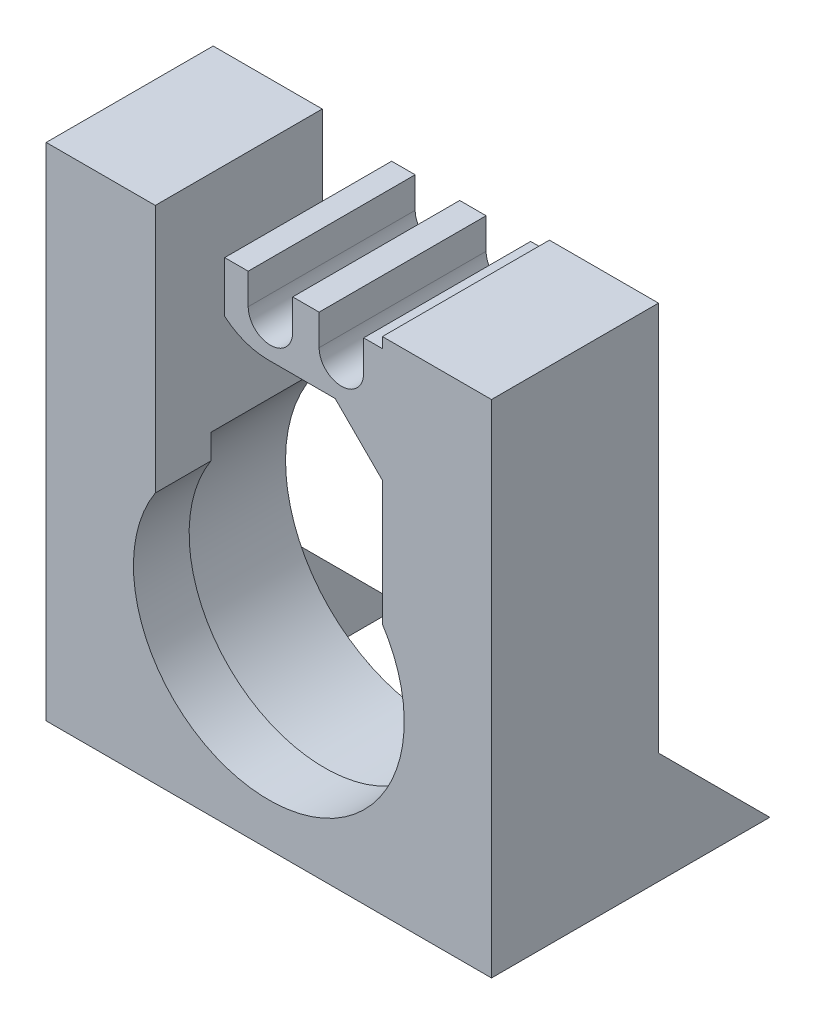
ISO-10303-21;
HEADER;
FILE_DESCRIPTION(('STEP AP214'),'2;1');
FILE_NAME('part.step','',(''),(''),'','','');
FILE_SCHEMA(('AUTOMOTIVE_DESIGN { 1 0 10303 214 1 1 1 1 }'));
ENDSEC;
DATA;
#1=APPLICATION_CONTEXT('core data for automotive mechanical design processes');
#2=APPLICATION_PROTOCOL_DEFINITION('international standard','automotive_design',2000,#1);
#3=PRODUCT_CONTEXT('',#1,'mechanical');
#4=PRODUCT('Part','Part','',(#3));
#5=PRODUCT_RELATED_PRODUCT_CATEGORY('part','',(#4));
#6=PRODUCT_DEFINITION_FORMATION('','',#4);
#7=PRODUCT_DEFINITION_CONTEXT('part definition',#1,'design');
#8=PRODUCT_DEFINITION('design','',#6,#7);
#9=PRODUCT_DEFINITION_SHAPE('','',#8);
#10=(LENGTH_UNIT() NAMED_UNIT(*) SI_UNIT(.MILLI.,.METRE.));
#11=(NAMED_UNIT(*) PLANE_ANGLE_UNIT() SI_UNIT($,.RADIAN.));
#12=(NAMED_UNIT(*) SI_UNIT($,.STERADIAN.) SOLID_ANGLE_UNIT());
#13=UNCERTAINTY_MEASURE_WITH_UNIT(LENGTH_MEASURE(1.E-05),#10,'distance_accuracy_value','');
#14=(GEOMETRIC_REPRESENTATION_CONTEXT(3) GLOBAL_UNCERTAINTY_ASSIGNED_CONTEXT((#13)) GLOBAL_UNIT_ASSIGNED_CONTEXT((#10,
#11,#12)) REPRESENTATION_CONTEXT('',''));
#15=CARTESIAN_POINT('',(0.,0.,0.));
#16=DIRECTION('',(0.,0.,1.));
#17=DIRECTION('',(1.,0.,0.));
#18=AXIS2_PLACEMENT_3D('',#15,#16,#17);
#19=CARTESIAN_POINT('',(20.1030178532085,21.387526043465,0.));
#20=DIRECTION('',(0.,0.,1.));
#21=DIRECTION('',(1.,0.,0.));
#22=AXIS2_PLACEMENT_3D('',#19,#20,#21);
#23=PLANE('',#22);
#24=DIRECTION('',(0.,1.,0.));
#25=VECTOR('',#24,1.);
#26=CARTESIAN_POINT('',(13.1030178532085,21.387526043465,0.));
#27=LINE('',#26,#25);
#28=CARTESIAN_POINT('',(13.1030178532084,11.387526043465,0.));
#29=VERTEX_POINT('',#28);
#30=CARTESIAN_POINT('',(13.1030178532085,21.387526043465,0.));
#31=VERTEX_POINT('',#30);
#32=EDGE_CURVE('E96',#29,#31,#27,.T.);
#33=ORIENTED_EDGE('',*,*,#32,.F.);
#34=DIRECTION('',(-1.,0.,0.));
#35=VECTOR('',#34,1.);
#36=CARTESIAN_POINT('',(20.1030178532084,11.387526043465,0.));
#37=LINE('',#36,#35);
#38=CARTESIAN_POINT('',(20.1030178532084,11.387526043465,0.));
#39=VERTEX_POINT('',#38);
#40=EDGE_CURVE('E12',#39,#29,#37,.T.);
#41=ORIENTED_EDGE('',*,*,#40,.F.);
#42=DIRECTION('',(0.,1.,0.));
#43=VECTOR('',#42,1.);
#44=CARTESIAN_POINT('',(20.1030178532085,21.387526043465,0.));
#45=LINE('',#44,#43);
#46=CARTESIAN_POINT('',(20.1030178532085,21.387526043465,0.));
#47=VERTEX_POINT('',#46);
#48=EDGE_CURVE('E88',#39,#47,#45,.T.);
#49=ORIENTED_EDGE('',*,*,#48,.T.);
#50=DIRECTION('',(-1.,0.,0.));
#51=VECTOR('',#50,1.);
#52=CARTESIAN_POINT('',(20.1030178532085,21.387526043465,0.));
#53=LINE('',#52,#51);
#54=EDGE_CURVE('E47',#47,#31,#53,.T.);
#55=ORIENTED_EDGE('',*,*,#54,.T.);
#56=EDGE_LOOP('',(#33,#41,#49,#55));
#57=FACE_BOUND('',#56,.T.);
#58=ADVANCED_FACE('F44',(#57),#23,.T.);
#59=CARTESIAN_POINT('',(20.1030178532084,11.387526043465,0.));
#60=DIRECTION('',(0.,-1.,0.));
#61=DIRECTION('',(0.,0.,-1.));
#62=AXIS2_PLACEMENT_3D('',#59,#60,#61);
#63=PLANE('',#62);
#64=DIRECTION('',(0.,0.,1.));
#65=VECTOR('',#64,1.);
#66=CARTESIAN_POINT('',(13.1030178532084,11.387526043465,0.));
#67=LINE('',#66,#65);
#68=CARTESIAN_POINT('',(13.1030178532084,11.387526043465,-10.));
#69=VERTEX_POINT('',#68);
#70=EDGE_CURVE('E90',#69,#29,#67,.T.);
#71=ORIENTED_EDGE('',*,*,#70,.F.);
#72=DIRECTION('',(-1.,0.,0.));
#73=VECTOR('',#72,1.);
#74=CARTESIAN_POINT('',(20.1030178532084,11.387526043465,-10.));
#75=LINE('',#74,#73);
#76=CARTESIAN_POINT('',(20.1030178532084,11.387526043465,-10.));
#77=VERTEX_POINT('',#76);
#78=EDGE_CURVE('E53',#77,#69,#75,.T.);
#79=ORIENTED_EDGE('',*,*,#78,.F.);
#80=DIRECTION('',(0.,0.,1.));
#81=VECTOR('',#80,1.);
#82=CARTESIAN_POINT('',(20.1030178532084,11.387526043465,0.));
#83=LINE('',#82,#81);
#84=EDGE_CURVE('E85',#77,#39,#83,.T.);
#85=ORIENTED_EDGE('',*,*,#84,.T.);
#86=ORIENTED_EDGE('',*,*,#40,.T.);
#87=EDGE_LOOP('',(#71,#79,#85,#86));
#88=FACE_BOUND('',#87,.T.);
#89=ADVANCED_FACE('F100',(#88),#63,.T.);
#90=CARTESIAN_POINT('',(20.1030178532084,11.387526043465,-10.));
#91=DIRECTION('',(0.,0.707106781186548,-0.707106781186547));
#92=DIRECTION('',(0.,0.707106781186547,0.707106781186548));
#93=AXIS2_PLACEMENT_3D('',#90,#91,#92);
#94=PLANE('',#93);
#95=DIRECTION('',(0.,-0.707106781186547,-0.707106781186548));
#96=VECTOR('',#95,1.);
#97=CARTESIAN_POINT('',(13.1030178532084,11.387526043465,-10.));
#98=LINE('',#97,#96);
#99=EDGE_CURVE('E83',#31,#69,#98,.T.);
#100=ORIENTED_EDGE('',*,*,#99,.F.);
#101=ORIENTED_EDGE('',*,*,#54,.F.);
#102=DIRECTION('',(0.,-0.707106781186547,-0.707106781186548));
#103=VECTOR('',#102,1.);
#104=CARTESIAN_POINT('',(20.1030178532084,11.387526043465,-10.));
#105=LINE('',#104,#103);
#106=EDGE_CURVE('E81',#47,#77,#105,.T.);
#107=ORIENTED_EDGE('',*,*,#106,.T.);
#108=ORIENTED_EDGE('',*,*,#78,.T.);
#109=EDGE_LOOP('',(#100,#101,#107,#108));
#110=FACE_BOUND('',#109,.T.);
#111=ADVANCED_FACE('F80',(#110),#94,.T.);
#112=CARTESIAN_POINT('',(20.1030178532084,0.,0.));
#113=DIRECTION('',(1.,0.,0.));
#114=DIRECTION('',(0.,1.,0.));
#115=AXIS2_PLACEMENT_3D('',#112,#113,#114);
#116=PLANE('',#115);
#117=ORIENTED_EDGE('',*,*,#48,.F.);
#118=ORIENTED_EDGE('',*,*,#84,.F.);
#119=ORIENTED_EDGE('',*,*,#106,.F.);
#120=EDGE_LOOP('',(#117,#118,#119));
#121=FACE_BOUND('',#120,.T.);
#122=ADVANCED_FACE('F87',(#121),#116,.T.);
#123=CARTESIAN_POINT('',(13.1030178532084,0.,0.));
#124=DIRECTION('',(1.,0.,0.));
#125=DIRECTION('',(0.,1.,0.));
#126=AXIS2_PLACEMENT_3D('',#123,#124,#125);
#127=PLANE('',#126);
#128=ORIENTED_EDGE('',*,*,#32,.T.);
#129=ORIENTED_EDGE('',*,*,#99,.T.);
#130=ORIENTED_EDGE('',*,*,#70,.T.);
#131=EDGE_LOOP('',(#128,#129,#130));
#132=FACE_BOUND('',#131,.T.);
#133=ADVANCED_FACE('F99',(#132),#127,.F.);
#134=CLOSED_SHELL('',(#58,#89,#111,#122,#133));
#135=MANIFOLD_SOLID_BREP('B2',#134);
#136=CARTESIAN_POINT('',(43.3043105971979,36.2386348756426,10.));
#137=DIRECTION('',(1.,0.,0.));
#138=DIRECTION('',(0.,0.,-1.));
#139=AXIS2_PLACEMENT_3D('',#136,#137,#138);
#140=PLANE('',#139);
#141=DIRECTION('',(0.,-1.,0.));
#142=VECTOR('',#141,1.);
#143=CARTESIAN_POINT('',(43.3043105971979,56.387526043465,15.));
#144=LINE('',#143,#142);
#145=CARTESIAN_POINT('',(43.3043105971979,45.2010543814346,15.));
#146=VERTEX_POINT('',#145);
#147=CARTESIAN_POINT('',(43.3043105971979,34.0145827194042,15.));
#148=VERTEX_POINT('',#147);
#149=EDGE_CURVE('E344',#146,#148,#144,.T.);
#150=ORIENTED_EDGE('',*,*,#149,.F.);
#151=DIRECTION('',(0.,0.,1.));
#152=VECTOR('',#151,1.);
#153=CARTESIAN_POINT('',(43.3043105971979,45.2010543814346,-17.4828176530083));
#154=LINE('',#153,#152);
#155=CARTESIAN_POINT('',(43.3043105971979,45.2010543814346,0.));
#156=VERTEX_POINT('',#155);
#157=EDGE_CURVE('E486',#156,#146,#154,.T.);
#158=ORIENTED_EDGE('',*,*,#157,.F.);
#159=DIRECTION('',(0.,-1.,0.));
#160=VECTOR('',#159,1.);
#161=CARTESIAN_POINT('',(43.3043105971979,36.2386348756426,0.));
#162=LINE('',#161,#160);
#163=CARTESIAN_POINT('',(43.3043105971979,36.2386348756426,0.));
#164=VERTEX_POINT('',#163);
#165=EDGE_CURVE('E388',#156,#164,#162,.T.);
#166=ORIENTED_EDGE('',*,*,#165,.T.);
#167=DIRECTION('',(0.,0.,-1.));
#168=VECTOR('',#167,1.);
#169=CARTESIAN_POINT('',(43.3043105971979,36.2386348756426,10.));
#170=LINE('',#169,#168);
#171=CARTESIAN_POINT('',(43.3043105971979,36.2386348756426,10.));
#172=VERTEX_POINT('',#171);
#173=EDGE_CURVE('E398',#172,#164,#170,.T.);
#174=ORIENTED_EDGE('',*,*,#173,.F.);
#175=DIRECTION('',(0.,-1.,0.));
#176=VECTOR('',#175,1.);
#177=CARTESIAN_POINT('',(43.3043105971979,56.387526043465,10.));
#178=LINE('',#177,#176);
#179=CARTESIAN_POINT('',(43.3043105971979,34.0145827194042,10.));
#180=VERTEX_POINT('',#179);
#181=EDGE_CURVE('E357',#172,#180,#178,.T.);
#182=ORIENTED_EDGE('',*,*,#181,.T.);
#183=DIRECTION('',(0.,0.,-1.));
#184=VECTOR('',#183,1.);
#185=CARTESIAN_POINT('',(43.3043105971979,34.0145827194042,15.));
#186=LINE('',#185,#184);
#187=EDGE_CURVE('E368',#148,#180,#186,.T.);
#188=ORIENTED_EDGE('',*,*,#187,.F.);
#189=EDGE_LOOP('',(#150,#158,#166,#174,#182,#188));
#190=FACE_BOUND('',#189,.T.);
#191=ADVANCED_FACE('F141',(#190),#140,.F.);
#192=CARTESIAN_POINT('',(33.1030178532085,27.3964843254976,0.));
#193=DIRECTION('',(0.,0.,1.));
#194=DIRECTION('',(1.,0.,0.));
#195=AXIS2_PLACEMENT_3D('',#192,#193,#194);
#196=PLANE('',#195);
#197=DIRECTION('',(1.,0.,0.));
#198=VECTOR('',#197,1.);
#199=CARTESIAN_POINT('',(46.1030178532085,21.387526043465,0.));
#200=LINE('',#199,#198);
#201=CARTESIAN_POINT('',(46.1030178532085,21.387526043465,0.));
#202=VERTEX_POINT('',#201);
#203=CARTESIAN_POINT('',(53.1030178532085,21.387526043465,0.));
#204=VERTEX_POINT('',#203);
#205=EDGE_CURVE('E360',#202,#204,#200,.T.);
#206=ORIENTED_EDGE('',*,*,#205,.F.);
#207=DIRECTION('',(0.,-1.,0.));
#208=VECTOR('',#207,1.);
#209=CARTESIAN_POINT('',(46.1030178532085,11.387526043465,0.));
#210=LINE('',#209,#208);
#211=CARTESIAN_POINT('',(46.1030178532084,11.387526043465,0.));
#212=VERTEX_POINT('',#211);
#213=EDGE_CURVE('E420',#202,#212,#210,.T.);
#214=ORIENTED_EDGE('',*,*,#213,.T.);
#215=DIRECTION('',(1.,0.,0.));
#216=VECTOR('',#215,1.);
#217=CARTESIAN_POINT('',(13.1030178532084,11.387526043465,0.));
#218=LINE('',#217,#216);
#219=CARTESIAN_POINT('',(13.1030178532084,11.387526043465,0.));
#220=VERTEX_POINT('',#219);
#221=EDGE_CURVE('E381',#220,#212,#218,.T.);
#222=ORIENTED_EDGE('',*,*,#221,.F.);
#223=DIRECTION('',(0.,-1.,0.));
#224=VECTOR('',#223,1.);
#225=CARTESIAN_POINT('',(13.1030178532085,56.387526043465,0.));
#226=LINE('',#225,#224);
#227=CARTESIAN_POINT('',(13.1030178532085,56.387526043465,0.));
#228=VERTEX_POINT('',#227);
#229=EDGE_CURVE('E379',#228,#220,#226,.T.);
#230=ORIENTED_EDGE('',*,*,#229,.F.);
#231=DIRECTION('',(-1.,0.,0.));
#232=VECTOR('',#231,1.);
#233=CARTESIAN_POINT('',(22.901725109219,56.387526043465,0.));
#234=LINE('',#233,#232);
#235=CARTESIAN_POINT('',(22.901725109219,56.387526043465,0.));
#236=VERTEX_POINT('',#235);
#237=EDGE_CURVE('E371',#236,#228,#234,.T.);
#238=ORIENTED_EDGE('',*,*,#237,.F.);
#239=DIRECTION('',(0.,1.,0.));
#240=VECTOR('',#239,1.);
#241=CARTESIAN_POINT('',(22.901725109219,36.2386348756426,0.));
#242=LINE('',#241,#240);
#243=CARTESIAN_POINT('',(22.901725109219,36.2386348756426,0.));
#244=VERTEX_POINT('',#243);
#245=EDGE_CURVE('E376',#244,#236,#242,.T.);
#246=ORIENTED_EDGE('',*,*,#245,.F.);
#247=CARTESIAN_POINT('',(33.1030178532085,27.3964843254976,0.));
#248=DIRECTION('',(0.,0.,-1.));
#249=DIRECTION('',(1.,0.,0.));
#250=AXIS2_PLACEMENT_3D('',#247,#248,#249);
#251=CIRCLE('',#250,13.5);
#252=EDGE_CURVE('E390',#164,#244,#251,.T.);
#253=ORIENTED_EDGE('',*,*,#252,.F.);
#254=ORIENTED_EDGE('',*,*,#165,.F.);
#255=DIRECTION('',(-0.707106781186551,0.707106781186544,0.));
#256=VECTOR('',#255,1.);
#257=CARTESIAN_POINT('',(43.3043105971979,45.2010543814346,0.));
#258=LINE('',#257,#256);
#259=CARTESIAN_POINT('',(39.0616699100786,49.4436950685538,0.));
#260=VERTEX_POINT('',#259);
#261=EDGE_CURVE('E446',#156,#260,#258,.T.);
#262=ORIENTED_EDGE('',*,*,#261,.T.);
#263=DIRECTION('',(-1.,0.,0.));
#264=VECTOR('',#263,1.);
#265=CARTESIAN_POINT('',(39.0616699100786,49.4436950685538,0.));
#266=LINE('',#265,#264);
#267=CARTESIAN_POINT('',(33.0253830112535,49.4436950685538,0.));
#268=VERTEX_POINT('',#267);
#269=EDGE_CURVE('E447',#260,#268,#266,.T.);
#270=ORIENTED_EDGE('',*,*,#269,.T.);
#271=CARTESIAN_POINT('',(33.0253830112535,55.4436950685539,0.));
#272=DIRECTION('',(0.,0.,1.));
#273=DIRECTION('',(1.,0.,0.));
#274=AXIS2_PLACEMENT_3D('',#271,#272,#273);
#275=CIRCLE('',#274,6.00000000000002);
#276=CARTESIAN_POINT('',(29.1361341145693,50.8749159078107,0.));
#277=VERTEX_POINT('',#276);
#278=EDGE_CURVE('E451',#268,#277,#275,.F.);
#279=ORIENTED_EDGE('',*,*,#278,.T.);
#280=DIRECTION('',(0.,1.,0.));
#281=VECTOR('',#280,1.);
#282=CARTESIAN_POINT('',(29.1361341145693,55.4436950685539,0.));
#283=LINE('',#282,#281);
#284=CARTESIAN_POINT('',(29.1361341145693,55.4436950685539,0.));
#285=VERTEX_POINT('',#284);
#286=EDGE_CURVE('E558',#277,#285,#283,.T.);
#287=ORIENTED_EDGE('',*,*,#286,.T.);
#288=DIRECTION('',(1.,0.,0.));
#289=VECTOR('',#288,1.);
#290=CARTESIAN_POINT('',(29.1361341145693,55.4436950685539,0.));
#291=LINE('',#290,#289);
#292=CARTESIAN_POINT('',(31.2468852178852,55.4436950685539,0.));
#293=VERTEX_POINT('',#292);
#294=EDGE_CURVE('E855',#285,#293,#291,.T.);
#295=ORIENTED_EDGE('',*,*,#294,.T.);
#296=DIRECTION('',(0.,-1.,0.));
#297=VECTOR('',#296,1.);
#298=CARTESIAN_POINT('',(31.2468852178852,55.4436950685539,0.));
#299=LINE('',#298,#297);
#300=CARTESIAN_POINT('',(31.2468852178852,52.6792236399918,0.));
#301=VERTEX_POINT('',#300);
#302=EDGE_CURVE('E547',#293,#301,#299,.T.);
#303=ORIENTED_EDGE('',*,*,#302,.T.);
#304=CARTESIAN_POINT('',(33.2468852178852,52.6792236399918,0.));
#305=DIRECTION('',(0.,0.,1.));
#306=DIRECTION('',(1.,0.,0.));
#307=AXIS2_PLACEMENT_3D('',#304,#305,#306);
#308=CIRCLE('',#307,2.);
#309=CARTESIAN_POINT('',(35.2468852178852,52.6792236399918,0.));
#310=VERTEX_POINT('',#309);
#311=EDGE_CURVE('E541',#301,#310,#308,.T.);
#312=ORIENTED_EDGE('',*,*,#311,.T.);
#313=DIRECTION('',(0.,1.,0.));
#314=VECTOR('',#313,1.);
#315=CARTESIAN_POINT('',(35.2468852178852,52.6792236399918,0.));
#316=LINE('',#315,#314);
#317=CARTESIAN_POINT('',(35.2468852178852,55.4436950685539,0.));
#318=VERTEX_POINT('',#317);
#319=EDGE_CURVE('E861',#310,#318,#316,.T.);
#320=ORIENTED_EDGE('',*,*,#319,.T.);
#321=DIRECTION('',(1.,0.,0.));
#322=VECTOR('',#321,1.);
#323=CARTESIAN_POINT('',(35.2468852178852,55.4436950685539,0.));
#324=LINE('',#323,#322);
#325=CARTESIAN_POINT('',(37.6193544062786,55.4436950685539,0.));
#326=VERTEX_POINT('',#325);
#327=EDGE_CURVE('E530',#318,#326,#324,.T.);
#328=ORIENTED_EDGE('',*,*,#327,.T.);
#329=DIRECTION('',(0.,-1.,0.));
#330=VECTOR('',#329,1.);
#331=CARTESIAN_POINT('',(37.6193544062786,55.4436950685539,0.));
#332=LINE('',#331,#330);
#333=CARTESIAN_POINT('',(37.6193544062786,52.6792236399918,0.));
#334=VERTEX_POINT('',#333);
#335=EDGE_CURVE('E524',#326,#334,#332,.T.);
#336=ORIENTED_EDGE('',*,*,#335,.T.);
#337=CARTESIAN_POINT('',(39.6193544062786,52.6792236399918,0.));
#338=DIRECTION('',(0.,0.,1.));
#339=DIRECTION('',(1.,0.,0.));
#340=AXIS2_PLACEMENT_3D('',#337,#338,#339);
#341=CIRCLE('',#340,2.);
#342=CARTESIAN_POINT('',(41.6193544062786,52.6792236399918,0.));
#343=VERTEX_POINT('',#342);
#344=EDGE_CURVE('E865',#334,#343,#341,.T.);
#345=ORIENTED_EDGE('',*,*,#344,.T.);
#346=DIRECTION('',(0.,1.,0.));
#347=VECTOR('',#346,1.);
#348=CARTESIAN_POINT('',(41.6193544062786,52.6792236399918,0.));
#349=LINE('',#348,#347);
#350=CARTESIAN_POINT('',(41.6193544062786,55.4436950685539,0.));
#351=VERTEX_POINT('',#350);
#352=EDGE_CURVE('E445',#343,#351,#349,.T.);
#353=ORIENTED_EDGE('',*,*,#352,.T.);
#354=DIRECTION('',(1.,0.,0.));
#355=VECTOR('',#354,1.);
#356=CARTESIAN_POINT('',(41.6193544062786,55.4436950685539,0.));
#357=LINE('',#356,#355);
#358=CARTESIAN_POINT('',(43.3043105971979,55.4436950685539,0.));
#359=VERTEX_POINT('',#358);
#360=EDGE_CURVE('E428',#351,#359,#357,.T.);
#361=ORIENTED_EDGE('',*,*,#360,.T.);
#362=CARTESIAN_POINT('',(43.3043105971979,56.387526043465,0.));
#363=VERTEX_POINT('',#362);
#364=EDGE_CURVE('E335',#363,#359,#162,.T.);
#365=ORIENTED_EDGE('',*,*,#364,.F.);
#366=DIRECTION('',(-1.,0.,0.));
#367=VECTOR('',#366,1.);
#368=CARTESIAN_POINT('',(43.3043105971979,56.387526043465,0.));
#369=LINE('',#368,#367);
#370=CARTESIAN_POINT('',(53.1030178532084,56.387526043465,0.));
#371=VERTEX_POINT('',#370);
#372=EDGE_CURVE('E386',#371,#363,#369,.T.);
#373=ORIENTED_EDGE('',*,*,#372,.F.);
#374=DIRECTION('',(0.,1.,0.));
#375=VECTOR('',#374,1.);
#376=CARTESIAN_POINT('',(53.1030178532084,56.387526043465,0.));
#377=LINE('',#376,#375);
#378=EDGE_CURVE('E384',#204,#371,#377,.T.);
#379=ORIENTED_EDGE('',*,*,#378,.F.);
#380=EDGE_LOOP('',(#206,#214,#222,#230,#238,#246,#253,#254,#262,#270,#279,#287,#295,#303,#312,
#320,#328,#336,#345,#353,#361,#365,#373,#379));
#381=FACE_BOUND('',#380,.T.);
#382=ADVANCED_FACE('F418',(#381),#196,.F.);
#383=CARTESIAN_POINT('',(22.901725109219,56.387526043465,10.));
#384=DIRECTION('',(0.,-1.,0.));
#385=DIRECTION('',(0.,0.,-1.));
#386=AXIS2_PLACEMENT_3D('',#383,#384,#385);
#387=PLANE('',#386);
#388=ORIENTED_EDGE('',*,*,#237,.T.);
#389=DIRECTION('',(0.,0.,-1.));
#390=VECTOR('',#389,1.);
#391=CARTESIAN_POINT('',(13.1030178532085,56.387526043465,10.));
#392=LINE('',#391,#390);
#393=CARTESIAN_POINT('',(13.1030178532085,56.387526043465,15.));
#394=VERTEX_POINT('',#393);
#395=EDGE_CURVE('E42',#394,#228,#392,.T.);
#396=ORIENTED_EDGE('',*,*,#395,.F.);
#397=DIRECTION('',(-1.,0.,0.));
#398=VECTOR('',#397,1.);
#399=CARTESIAN_POINT('',(13.1030178532085,56.387526043465,15.));
#400=LINE('',#399,#398);
#401=CARTESIAN_POINT('',(22.901725109219,56.387526043465,15.));
#402=VERTEX_POINT('',#401);
#403=EDGE_CURVE('E353',#402,#394,#400,.T.);
#404=ORIENTED_EDGE('',*,*,#403,.F.);
#405=DIRECTION('',(0.,0.,-1.));
#406=VECTOR('',#405,1.);
#407=CARTESIAN_POINT('',(22.901725109219,56.387526043465,10.));
#408=LINE('',#407,#406);
#409=EDGE_CURVE('E375',#402,#236,#408,.T.);
#410=ORIENTED_EDGE('',*,*,#409,.T.);
#411=EDGE_LOOP('',(#388,#396,#404,#410));
#412=FACE_BOUND('',#411,.T.);
#413=ADVANCED_FACE('F143',(#412),#387,.F.);
#414=CARTESIAN_POINT('',(13.1030178532085,56.387526043465,10.));
#415=DIRECTION('',(1.,0.,0.));
#416=DIRECTION('',(0.,1.,0.));
#417=AXIS2_PLACEMENT_3D('',#414,#415,#416);
#418=PLANE('',#417);
#419=ORIENTED_EDGE('',*,*,#229,.T.);
#420=DIRECTION('',(0.,0.,-1.));
#421=VECTOR('',#420,1.);
#422=CARTESIAN_POINT('',(13.1030178532084,11.387526043465,10.));
#423=LINE('',#422,#421);
#424=CARTESIAN_POINT('',(13.1030178532084,11.387526043465,15.));
#425=VERTEX_POINT('',#424);
#426=EDGE_CURVE('E149',#425,#220,#423,.T.);
#427=ORIENTED_EDGE('',*,*,#426,.F.);
#428=DIRECTION('',(0.,-1.,0.));
#429=VECTOR('',#428,1.);
#430=CARTESIAN_POINT('',(13.1030178532085,56.387526043465,15.));
#431=LINE('',#430,#429);
#432=EDGE_CURVE('E365',#394,#425,#431,.T.);
#433=ORIENTED_EDGE('',*,*,#432,.F.);
#434=ORIENTED_EDGE('',*,*,#395,.T.);
#435=EDGE_LOOP('',(#419,#427,#433,#434));
#436=FACE_BOUND('',#435,.T.);
#437=ADVANCED_FACE('F621',(#436),#418,.F.);
#438=CARTESIAN_POINT('',(13.1030178532084,11.387526043465,10.));
#439=DIRECTION('',(0.,1.,0.));
#440=DIRECTION('',(-1.,0.,0.));
#441=AXIS2_PLACEMENT_3D('',#438,#439,#440);
#442=PLANE('',#441);
#443=ORIENTED_EDGE('',*,*,#221,.T.);
#444=DIRECTION('',(0.,0.,-1.));
#445=VECTOR('',#444,1.);
#446=CARTESIAN_POINT('',(46.1030178532085,11.387526043465,-10.));
#447=LINE('',#446,#445);
#448=CARTESIAN_POINT('',(46.1030178532085,11.387526043465,-10.));
#449=VERTEX_POINT('',#448);
#450=EDGE_CURVE('E164',#212,#449,#447,.T.);
#451=ORIENTED_EDGE('',*,*,#450,.T.);
#452=DIRECTION('',(1.,0.,0.));
#453=VECTOR('',#452,1.);
#454=CARTESIAN_POINT('',(46.1030178532085,11.387526043465,-10.));
#455=LINE('',#454,#453);
#456=CARTESIAN_POINT('',(53.1030178532085,11.387526043465,-10.));
#457=VERTEX_POINT('',#456);
#458=EDGE_CURVE('E432',#449,#457,#455,.T.);
#459=ORIENTED_EDGE('',*,*,#458,.T.);
#460=DIRECTION('',(0.,0.,-1.));
#461=VECTOR('',#460,1.);
#462=CARTESIAN_POINT('',(53.1030178532085,11.387526043465,10.));
#463=LINE('',#462,#461);
#464=CARTESIAN_POINT('',(53.1030178532085,11.387526043465,15.));
#465=VERTEX_POINT('',#464);
#466=EDGE_CURVE('E406',#465,#457,#463,.T.);
#467=ORIENTED_EDGE('',*,*,#466,.F.);
#468=DIRECTION('',(1.,0.,0.));
#469=VECTOR('',#468,1.);
#470=CARTESIAN_POINT('',(13.1030178532084,11.387526043465,15.));
#471=LINE('',#470,#469);
#472=EDGE_CURVE('E413',#425,#465,#471,.T.);
#473=ORIENTED_EDGE('',*,*,#472,.F.);
#474=ORIENTED_EDGE('',*,*,#426,.T.);
#475=EDGE_LOOP('',(#443,#451,#459,#467,#473,#474));
#476=FACE_BOUND('',#475,.T.);
#477=ADVANCED_FACE('F411',(#476),#442,.F.);
#478=CARTESIAN_POINT('',(53.1030178532084,56.387526043465,10.));
#479=DIRECTION('',(-1.,0.,0.));
#480=DIRECTION('',(0.,-1.,0.));
#481=AXIS2_PLACEMENT_3D('',#478,#479,#480);
#482=PLANE('',#481);
#483=ORIENTED_EDGE('',*,*,#466,.T.);
#484=DIRECTION('',(0.,0.707106781186548,0.707106781186548));
#485=VECTOR('',#484,1.);
#486=CARTESIAN_POINT('',(53.1030178532085,21.387526043465,0.));
#487=LINE('',#486,#485);
#488=EDGE_CURVE('E423',#457,#204,#487,.T.);
#489=ORIENTED_EDGE('',*,*,#488,.T.);
#490=ORIENTED_EDGE('',*,*,#378,.T.);
#491=DIRECTION('',(0.,0.,-1.));
#492=VECTOR('',#491,1.);
#493=CARTESIAN_POINT('',(53.1030178532084,56.387526043465,10.));
#494=LINE('',#493,#492);
#495=CARTESIAN_POINT('',(53.1030178532084,56.387526043465,15.));
#496=VERTEX_POINT('',#495);
#497=EDGE_CURVE('E403',#496,#371,#494,.T.);
#498=ORIENTED_EDGE('',*,*,#497,.F.);
#499=DIRECTION('',(0.,1.,0.));
#500=VECTOR('',#499,1.);
#501=CARTESIAN_POINT('',(53.1030178532085,11.387526043465,15.));
#502=LINE('',#501,#500);
#503=EDGE_CURVE('E438',#465,#496,#502,.T.);
#504=ORIENTED_EDGE('',*,*,#503,.F.);
#505=EDGE_LOOP('',(#483,#489,#490,#498,#504));
#506=FACE_BOUND('',#505,.T.);
#507=ADVANCED_FACE('F614',(#506),#482,.F.);
#508=CARTESIAN_POINT('',(43.3043105971979,56.387526043465,10.));
#509=DIRECTION('',(0.,-1.,0.));
#510=DIRECTION('',(0.,0.,-1.));
#511=AXIS2_PLACEMENT_3D('',#508,#509,#510);
#512=PLANE('',#511);
#513=ORIENTED_EDGE('',*,*,#372,.T.);
#514=DIRECTION('',(0.,0.,-1.));
#515=VECTOR('',#514,1.);
#516=CARTESIAN_POINT('',(43.3043105971979,56.387526043465,10.));
#517=LINE('',#516,#515);
#518=CARTESIAN_POINT('',(43.3043105971979,56.387526043465,15.));
#519=VERTEX_POINT('',#518);
#520=EDGE_CURVE('E401',#519,#363,#517,.T.);
#521=ORIENTED_EDGE('',*,*,#520,.F.);
#522=DIRECTION('',(-1.,0.,0.));
#523=VECTOR('',#522,1.);
#524=CARTESIAN_POINT('',(53.1030178532084,56.387526043465,15.));
#525=LINE('',#524,#523);
#526=EDGE_CURVE('E342',#496,#519,#525,.T.);
#527=ORIENTED_EDGE('',*,*,#526,.F.);
#528=ORIENTED_EDGE('',*,*,#497,.T.);
#529=EDGE_LOOP('',(#513,#521,#527,#528));
#530=FACE_BOUND('',#529,.T.);
#531=ADVANCED_FACE('F442',(#530),#512,.F.);
#532=ORIENTED_EDGE('',*,*,#364,.T.);
#533=DIRECTION('',(0.,0.,1.));
#534=VECTOR('',#533,1.);
#535=CARTESIAN_POINT('',(43.3043105971979,55.4436950685539,-17.4828176530083));
#536=LINE('',#535,#534);
#537=CARTESIAN_POINT('',(43.3043105971979,55.4436950685539,15.));
#538=VERTEX_POINT('',#537);
#539=EDGE_CURVE('E320',#359,#538,#536,.T.);
#540=ORIENTED_EDGE('',*,*,#539,.T.);
#541=EDGE_CURVE('E333',#519,#538,#144,.T.);
#542=ORIENTED_EDGE('',*,*,#541,.F.);
#543=ORIENTED_EDGE('',*,*,#520,.T.);
#544=EDGE_LOOP('',(#532,#540,#542,#543));
#545=FACE_BOUND('',#544,.T.);
#546=ADVANCED_FACE('F331',(#545),#140,.F.);
#547=CARTESIAN_POINT('',(33.1030178532085,27.3964843254976,10.));
#548=DIRECTION('',(0.,0.,-1.));
#549=DIRECTION('',(-1.,0.,0.));
#550=AXIS2_PLACEMENT_3D('',#547,#548,#549);
#551=CYLINDRICAL_SURFACE('',#550,13.5);
#552=ORIENTED_EDGE('',*,*,#252,.T.);
#553=DIRECTION('',(0.,0.,-1.));
#554=VECTOR('',#553,1.);
#555=CARTESIAN_POINT('',(22.901725109219,36.2386348756426,10.));
#556=LINE('',#555,#554);
#557=CARTESIAN_POINT('',(22.901725109219,36.2386348756426,10.));
#558=VERTEX_POINT('',#557);
#559=EDGE_CURVE('E395',#558,#244,#556,.T.);
#560=ORIENTED_EDGE('',*,*,#559,.F.);
#561=CARTESIAN_POINT('',(33.1030178532085,27.3964843254976,10.));
#562=DIRECTION('',(0.,0.,-1.));
#563=DIRECTION('',(1.,0.,0.));
#564=AXIS2_PLACEMENT_3D('',#561,#562,#563);
#565=CIRCLE('',#564,13.5);
#566=EDGE_CURVE('E372',#172,#558,#565,.T.);
#567=ORIENTED_EDGE('',*,*,#566,.F.);
#568=ORIENTED_EDGE('',*,*,#173,.T.);
#569=EDGE_LOOP('',(#552,#560,#567,#568));
#570=FACE_BOUND('',#569,.T.);
#571=ADVANCED_FACE('F587',(#570),#551,.F.);
#572=CARTESIAN_POINT('',(22.901725109219,36.2386348756426,10.));
#573=DIRECTION('',(-1.,0.,0.));
#574=DIRECTION('',(0.,0.,1.));
#575=AXIS2_PLACEMENT_3D('',#572,#573,#574);
#576=PLANE('',#575);
#577=ORIENTED_EDGE('',*,*,#245,.T.);
#578=ORIENTED_EDGE('',*,*,#409,.F.);
#579=DIRECTION('',(0.,1.,0.));
#580=VECTOR('',#579,1.);
#581=CARTESIAN_POINT('',(22.901725109219,56.387526043465,15.));
#582=LINE('',#581,#580);
#583=CARTESIAN_POINT('',(22.901725109219,34.0145827194042,15.));
#584=VERTEX_POINT('',#583);
#585=EDGE_CURVE('E346',#584,#402,#582,.T.);
#586=ORIENTED_EDGE('',*,*,#585,.F.);
#587=DIRECTION('',(0.,0.,-1.));
#588=VECTOR('',#587,1.);
#589=CARTESIAN_POINT('',(22.901725109219,34.0145827194042,15.));
#590=LINE('',#589,#588);
#591=CARTESIAN_POINT('',(22.901725109219,34.0145827194042,10.));
#592=VERTEX_POINT('',#591);
#593=EDGE_CURVE('E356',#584,#592,#590,.T.);
#594=ORIENTED_EDGE('',*,*,#593,.T.);
#595=DIRECTION('',(0.,1.,0.));
#596=VECTOR('',#595,1.);
#597=CARTESIAN_POINT('',(22.901725109219,56.387526043465,10.));
#598=LINE('',#597,#596);
#599=EDGE_CURVE('E362',#592,#558,#598,.T.);
#600=ORIENTED_EDGE('',*,*,#599,.T.);
#601=ORIENTED_EDGE('',*,*,#559,.T.);
#602=EDGE_LOOP('',(#577,#578,#586,#594,#600,#601));
#603=FACE_BOUND('',#602,.T.);
#604=ADVANCED_FACE('F582',(#603),#576,.F.);
#605=CARTESIAN_POINT('',(33.1030178532085,27.3964843254976,10.));
#606=DIRECTION('',(0.,0.,1.));
#607=DIRECTION('',(1.,0.,0.));
#608=AXIS2_PLACEMENT_3D('',#605,#606,#607);
#609=PLANE('',#608);
#610=ORIENTED_EDGE('',*,*,#181,.F.);
#611=ORIENTED_EDGE('',*,*,#566,.T.);
#612=ORIENTED_EDGE('',*,*,#599,.F.);
#613=CARTESIAN_POINT('',(33.1030178532085,27.3964843254976,10.));
#614=DIRECTION('',(0.,0.,-1.));
#615=DIRECTION('',(1.,0.,0.));
#616=AXIS2_PLACEMENT_3D('',#613,#614,#615);
#617=CIRCLE('',#616,12.16);
#618=EDGE_CURVE('E359',#180,#592,#617,.T.);
#619=ORIENTED_EDGE('',*,*,#618,.F.);
#620=EDGE_LOOP('',(#610,#611,#612,#619));
#621=FACE_BOUND('',#620,.T.);
#622=ADVANCED_FACE('F591',(#621),#609,.F.);
#623=CARTESIAN_POINT('',(33.1030178532085,27.3964843254976,15.));
#624=DIRECTION('',(0.,0.,-1.));
#625=DIRECTION('',(-1.,0.,0.));
#626=AXIS2_PLACEMENT_3D('',#623,#624,#625);
#627=CYLINDRICAL_SURFACE('',#626,12.16);
#628=ORIENTED_EDGE('',*,*,#618,.T.);
#629=ORIENTED_EDGE('',*,*,#593,.F.);
#630=CARTESIAN_POINT('',(33.1030178532085,27.3964843254976,15.));
#631=DIRECTION('',(0.,0.,-1.));
#632=DIRECTION('',(1.,0.,0.));
#633=AXIS2_PLACEMENT_3D('',#630,#631,#632);
#634=CIRCLE('',#633,12.16);
#635=EDGE_CURVE('E343',#148,#584,#634,.T.);
#636=ORIENTED_EDGE('',*,*,#635,.F.);
#637=ORIENTED_EDGE('',*,*,#187,.T.);
#638=EDGE_LOOP('',(#628,#629,#636,#637));
#639=FACE_BOUND('',#638,.T.);
#640=ADVANCED_FACE('F578',(#639),#627,.F.);
#641=CARTESIAN_POINT('',(33.1030178532085,27.3964843254976,15.));
#642=DIRECTION('',(0.,0.,1.));
#643=DIRECTION('',(1.,0.,0.));
#644=AXIS2_PLACEMENT_3D('',#641,#642,#643);
#645=PLANE('',#644);
#646=ORIENTED_EDGE('',*,*,#432,.T.);
#647=ORIENTED_EDGE('',*,*,#472,.T.);
#648=ORIENTED_EDGE('',*,*,#503,.T.);
#649=ORIENTED_EDGE('',*,*,#526,.T.);
#650=ORIENTED_EDGE('',*,*,#541,.T.);
#651=DIRECTION('',(-1.,0.,0.));
#652=VECTOR('',#651,1.);
#653=CARTESIAN_POINT('',(41.6193544062786,55.4436950685539,15.));
#654=LINE('',#653,#652);
#655=CARTESIAN_POINT('',(41.6193544062786,55.4436950685539,15.));
#656=VERTEX_POINT('',#655);
#657=EDGE_CURVE('E316',#538,#656,#654,.T.);
#658=ORIENTED_EDGE('',*,*,#657,.T.);
#659=DIRECTION('',(0.,-1.,0.));
#660=VECTOR('',#659,1.);
#661=CARTESIAN_POINT('',(41.6193544062786,52.6792236399918,15.));
#662=LINE('',#661,#660);
#663=CARTESIAN_POINT('',(41.6193544062786,52.6792236399918,15.));
#664=VERTEX_POINT('',#663);
#665=EDGE_CURVE('E327',#656,#664,#662,.T.);
#666=ORIENTED_EDGE('',*,*,#665,.T.);
#667=CARTESIAN_POINT('',(39.6193544062786,52.6792236399918,15.));
#668=DIRECTION('',(0.,0.,-1.));
#669=DIRECTION('',(1.,0.,0.));
#670=AXIS2_PLACEMENT_3D('',#667,#668,#669);
#671=CIRCLE('',#670,2.);
#672=CARTESIAN_POINT('',(37.6193544062786,52.6792236399918,15.));
#673=VERTEX_POINT('',#672);
#674=EDGE_CURVE('E456',#664,#673,#671,.T.);
#675=ORIENTED_EDGE('',*,*,#674,.T.);
#676=DIRECTION('',(0.,1.,0.));
#677=VECTOR('',#676,1.);
#678=CARTESIAN_POINT('',(37.6193544062786,55.4436950685539,15.));
#679=LINE('',#678,#677);
#680=CARTESIAN_POINT('',(37.6193544062786,55.4436950685539,15.));
#681=VERTEX_POINT('',#680);
#682=EDGE_CURVE('E459',#673,#681,#679,.T.);
#683=ORIENTED_EDGE('',*,*,#682,.T.);
#684=DIRECTION('',(-1.,0.,0.));
#685=VECTOR('',#684,1.);
#686=CARTESIAN_POINT('',(35.2468852178852,55.4436950685539,15.));
#687=LINE('',#686,#685);
#688=CARTESIAN_POINT('',(35.2468852178852,55.4436950685539,15.));
#689=VERTEX_POINT('',#688);
#690=EDGE_CURVE('E462',#681,#689,#687,.T.);
#691=ORIENTED_EDGE('',*,*,#690,.T.);
#692=DIRECTION('',(0.,-1.,0.));
#693=VECTOR('',#692,1.);
#694=CARTESIAN_POINT('',(35.2468852178852,52.6792236399918,15.));
#695=LINE('',#694,#693);
#696=CARTESIAN_POINT('',(35.2468852178852,52.6792236399918,15.));
#697=VERTEX_POINT('',#696);
#698=EDGE_CURVE('E465',#689,#697,#695,.T.);
#699=ORIENTED_EDGE('',*,*,#698,.T.);
#700=CARTESIAN_POINT('',(33.2468852178852,52.6792236399918,15.));
#701=DIRECTION('',(0.,0.,-1.));
#702=DIRECTION('',(1.,0.,0.));
#703=AXIS2_PLACEMENT_3D('',#700,#701,#702);
#704=CIRCLE('',#703,2.);
#705=CARTESIAN_POINT('',(31.2468852178852,52.6792236399918,15.));
#706=VERTEX_POINT('',#705);
#707=EDGE_CURVE('E468',#697,#706,#704,.T.);
#708=ORIENTED_EDGE('',*,*,#707,.T.);
#709=DIRECTION('',(0.,1.,0.));
#710=VECTOR('',#709,1.);
#711=CARTESIAN_POINT('',(31.2468852178852,55.4436950685539,15.));
#712=LINE('',#711,#710);
#713=CARTESIAN_POINT('',(31.2468852178852,55.4436950685539,15.));
#714=VERTEX_POINT('',#713);
#715=EDGE_CURVE('E471',#706,#714,#712,.T.);
#716=ORIENTED_EDGE('',*,*,#715,.T.);
#717=DIRECTION('',(-1.,0.,0.));
#718=VECTOR('',#717,1.);
#719=CARTESIAN_POINT('',(29.1361341145693,55.4436950685539,15.));
#720=LINE('',#719,#718);
#721=CARTESIAN_POINT('',(29.1361341145693,55.4436950685539,15.));
#722=VERTEX_POINT('',#721);
#723=EDGE_CURVE('E474',#714,#722,#720,.T.);
#724=ORIENTED_EDGE('',*,*,#723,.T.);
#725=DIRECTION('',(0.,-1.,0.));
#726=VECTOR('',#725,1.);
#727=CARTESIAN_POINT('',(29.1361341145693,55.4436950685539,15.));
#728=LINE('',#727,#726);
#729=CARTESIAN_POINT('',(29.1361341145693,50.8749159078107,15.));
#730=VERTEX_POINT('',#729);
#731=EDGE_CURVE('E477',#722,#730,#728,.T.);
#732=ORIENTED_EDGE('',*,*,#731,.T.);
#733=CARTESIAN_POINT('',(33.0253830112535,55.4436950685539,15.));
#734=DIRECTION('',(0.,0.,1.));
#735=DIRECTION('',(-1.,0.,0.));
#736=AXIS2_PLACEMENT_3D('',#733,#734,#735);
#737=CIRCLE('',#736,6.00000000000002);
#738=CARTESIAN_POINT('',(33.0253830112535,49.4436950685538,15.));
#739=VERTEX_POINT('',#738);
#740=EDGE_CURVE('E480',#730,#739,#737,.T.);
#741=ORIENTED_EDGE('',*,*,#740,.T.);
#742=DIRECTION('',(1.,0.,0.));
#743=VECTOR('',#742,1.);
#744=CARTESIAN_POINT('',(39.0616699100786,49.4436950685538,15.));
#745=LINE('',#744,#743);
#746=CARTESIAN_POINT('',(39.0616699100786,49.4436950685538,15.));
#747=VERTEX_POINT('',#746);
#748=EDGE_CURVE('E483',#739,#747,#745,.T.);
#749=ORIENTED_EDGE('',*,*,#748,.T.);
#750=DIRECTION('',(0.707106781186551,-0.707106781186544,0.));
#751=VECTOR('',#750,1.);
#752=CARTESIAN_POINT('',(43.3043105971979,45.2010543814346,15.));
#753=LINE('',#752,#751);
#754=EDGE_CURVE('E156',#747,#146,#753,.T.);
#755=ORIENTED_EDGE('',*,*,#754,.T.);
#756=ORIENTED_EDGE('',*,*,#149,.T.);
#757=ORIENTED_EDGE('',*,*,#635,.T.);
#758=ORIENTED_EDGE('',*,*,#585,.T.);
#759=ORIENTED_EDGE('',*,*,#403,.T.);
#760=EDGE_LOOP('',(#646,#647,#648,#649,#650,#658,#666,#675,#683,#691,#699,#708,#716,#724,#732,
#741,#749,#755,#756,#757,#758,#759));
#761=FACE_BOUND('',#760,.T.);
#762=ADVANCED_FACE('F339',(#761),#645,.T.);
#763=CARTESIAN_POINT('',(46.1030178532085,21.387526043465,0.));
#764=DIRECTION('',(0.,0.707106781186547,-0.707106781186547));
#765=DIRECTION('',(0.,0.707106781186548,0.707106781186548));
#766=AXIS2_PLACEMENT_3D('',#763,#764,#765);
#767=PLANE('',#766);
#768=ORIENTED_EDGE('',*,*,#488,.F.);
#769=ORIENTED_EDGE('',*,*,#458,.F.);
#770=DIRECTION('',(0.,0.707106781186548,0.707106781186548));
#771=VECTOR('',#770,1.);
#772=CARTESIAN_POINT('',(46.1030178532085,21.387526043465,0.));
#773=LINE('',#772,#771);
#774=EDGE_CURVE('E425',#449,#202,#773,.T.);
#775=ORIENTED_EDGE('',*,*,#774,.T.);
#776=ORIENTED_EDGE('',*,*,#205,.T.);
#777=EDGE_LOOP('',(#768,#769,#775,#776));
#778=FACE_BOUND('',#777,.T.);
#779=ADVANCED_FACE('F652',(#778),#767,.T.);
#780=CARTESIAN_POINT('',(46.1030178532085,0.,0.));
#781=DIRECTION('',(1.,0.,0.));
#782=DIRECTION('',(0.,0.,-1.));
#783=AXIS2_PLACEMENT_3D('',#780,#781,#782);
#784=PLANE('',#783);
#785=ORIENTED_EDGE('',*,*,#213,.F.);
#786=ORIENTED_EDGE('',*,*,#774,.F.);
#787=ORIENTED_EDGE('',*,*,#450,.F.);
#788=EDGE_LOOP('',(#785,#786,#787));
#789=FACE_BOUND('',#788,.T.);
#790=ADVANCED_FACE('F662',(#789),#784,.F.);
#791=CARTESIAN_POINT('',(43.3043105971979,45.2010543814346,-17.4828176530083));
#792=DIRECTION('',(-0.707106781186544,-0.707106781186551,0.));
#793=DIRECTION('',(0.707106781186551,-0.707106781186544,0.));
#794=AXIS2_PLACEMENT_3D('',#791,#792,#793);
#795=PLANE('',#794);
#796=ORIENTED_EDGE('',*,*,#261,.F.);
#797=ORIENTED_EDGE('',*,*,#157,.T.);
#798=ORIENTED_EDGE('',*,*,#754,.F.);
#799=DIRECTION('',(0.,0.,1.));
#800=VECTOR('',#799,1.);
#801=CARTESIAN_POINT('',(39.0616699100786,49.4436950685538,-17.4828176530083));
#802=LINE('',#801,#800);
#803=EDGE_CURVE('E488',#260,#747,#802,.T.);
#804=ORIENTED_EDGE('',*,*,#803,.F.);
#805=EDGE_LOOP('',(#796,#797,#798,#804));
#806=FACE_BOUND('',#805,.T.);
#807=ADVANCED_FACE('F568',(#806),#795,.T.);
#808=CARTESIAN_POINT('',(39.0616699100786,49.4436950685538,-17.4828176530083));
#809=DIRECTION('',(0.,-1.,0.));
#810=DIRECTION('',(0.,0.,-1.));
#811=AXIS2_PLACEMENT_3D('',#808,#809,#810);
#812=PLANE('',#811);
#813=ORIENTED_EDGE('',*,*,#269,.F.);
#814=ORIENTED_EDGE('',*,*,#803,.T.);
#815=ORIENTED_EDGE('',*,*,#748,.F.);
#816=DIRECTION('',(0.,0.,1.));
#817=VECTOR('',#816,1.);
#818=CARTESIAN_POINT('',(33.0253830112535,49.4436950685538,-17.4828176530083));
#819=LINE('',#818,#817);
#820=EDGE_CURVE('E490',#268,#739,#819,.T.);
#821=ORIENTED_EDGE('',*,*,#820,.F.);
#822=EDGE_LOOP('',(#813,#814,#815,#821));
#823=FACE_BOUND('',#822,.T.);
#824=ADVANCED_FACE('F565',(#823),#812,.T.);
#825=CARTESIAN_POINT('',(33.0253830112535,55.4436950685539,-17.4828176530083));
#826=DIRECTION('',(0.,0.,1.));
#827=DIRECTION('',(1.,0.,0.));
#828=AXIS2_PLACEMENT_3D('',#825,#826,#827);
#829=CYLINDRICAL_SURFACE('',#828,6.00000000000002);
#830=ORIENTED_EDGE('',*,*,#278,.F.);
#831=ORIENTED_EDGE('',*,*,#820,.T.);
#832=ORIENTED_EDGE('',*,*,#740,.F.);
#833=DIRECTION('',(0.,0.,1.));
#834=VECTOR('',#833,1.);
#835=CARTESIAN_POINT('',(29.1361341145693,50.8749159078107,-17.4828176530083));
#836=LINE('',#835,#834);
#837=EDGE_CURVE('E492',#277,#730,#836,.T.);
#838=ORIENTED_EDGE('',*,*,#837,.F.);
#839=EDGE_LOOP('',(#830,#831,#832,#838));
#840=FACE_BOUND('',#839,.T.);
#841=ADVANCED_FACE('F561',(#840),#829,.T.);
#842=CARTESIAN_POINT('',(29.1361341145693,55.4436950685539,-17.4828176530083));
#843=DIRECTION('',(-1.,0.,0.));
#844=DIRECTION('',(0.,0.,1.));
#845=AXIS2_PLACEMENT_3D('',#842,#843,#844);
#846=PLANE('',#845);
#847=ORIENTED_EDGE('',*,*,#286,.F.);
#848=ORIENTED_EDGE('',*,*,#837,.T.);
#849=ORIENTED_EDGE('',*,*,#731,.F.);
#850=DIRECTION('',(0.,0.,1.));
#851=VECTOR('',#850,1.);
#852=CARTESIAN_POINT('',(29.1361341145693,55.4436950685539,-17.4828176530083));
#853=LINE('',#852,#851);
#854=EDGE_CURVE('E494',#285,#722,#853,.T.);
#855=ORIENTED_EDGE('',*,*,#854,.F.);
#856=EDGE_LOOP('',(#847,#848,#849,#855));
#857=FACE_BOUND('',#856,.T.);
#858=ADVANCED_FACE('F556',(#857),#846,.T.);
#859=CARTESIAN_POINT('',(29.1361341145693,55.4436950685539,-17.4828176530083));
#860=DIRECTION('',(0.,1.,0.));
#861=DIRECTION('',(0.,0.,1.));
#862=AXIS2_PLACEMENT_3D('',#859,#860,#861);
#863=PLANE('',#862);
#864=ORIENTED_EDGE('',*,*,#294,.F.);
#865=ORIENTED_EDGE('',*,*,#854,.T.);
#866=ORIENTED_EDGE('',*,*,#723,.F.);
#867=DIRECTION('',(0.,0.,1.));
#868=VECTOR('',#867,1.);
#869=CARTESIAN_POINT('',(31.2468852178852,55.4436950685539,-17.4828176530083));
#870=LINE('',#869,#868);
#871=EDGE_CURVE('E496',#293,#714,#870,.T.);
#872=ORIENTED_EDGE('',*,*,#871,.F.);
#873=EDGE_LOOP('',(#864,#865,#866,#872));
#874=FACE_BOUND('',#873,.T.);
#875=ADVANCED_FACE('F550',(#874),#863,.T.);
#876=CARTESIAN_POINT('',(31.2468852178852,55.4436950685539,-17.4828176530083));
#877=DIRECTION('',(1.,0.,0.));
#878=DIRECTION('',(0.,0.,-1.));
#879=AXIS2_PLACEMENT_3D('',#876,#877,#878);
#880=PLANE('',#879);
#881=ORIENTED_EDGE('',*,*,#302,.F.);
#882=ORIENTED_EDGE('',*,*,#871,.T.);
#883=ORIENTED_EDGE('',*,*,#715,.F.);
#884=DIRECTION('',(0.,0.,1.));
#885=VECTOR('',#884,1.);
#886=CARTESIAN_POINT('',(31.2468852178852,52.6792236399918,-17.4828176530083));
#887=LINE('',#886,#885);
#888=EDGE_CURVE('E498',#301,#706,#887,.T.);
#889=ORIENTED_EDGE('',*,*,#888,.F.);
#890=EDGE_LOOP('',(#881,#882,#883,#889));
#891=FACE_BOUND('',#890,.T.);
#892=ADVANCED_FACE('F544',(#891),#880,.T.);
#893=CARTESIAN_POINT('',(33.2468852178852,52.6792236399918,-17.4828176530083));
#894=DIRECTION('',(0.,0.,1.));
#895=DIRECTION('',(1.,0.,0.));
#896=AXIS2_PLACEMENT_3D('',#893,#894,#895);
#897=CYLINDRICAL_SURFACE('',#896,2.);
#898=ORIENTED_EDGE('',*,*,#311,.F.);
#899=ORIENTED_EDGE('',*,*,#888,.T.);
#900=ORIENTED_EDGE('',*,*,#707,.F.);
#901=DIRECTION('',(0.,0.,1.));
#902=VECTOR('',#901,1.);
#903=CARTESIAN_POINT('',(35.2468852178852,52.6792236399918,-17.4828176530083));
#904=LINE('',#903,#902);
#905=EDGE_CURVE('E500',#310,#697,#904,.T.);
#906=ORIENTED_EDGE('',*,*,#905,.F.);
#907=EDGE_LOOP('',(#898,#899,#900,#906));
#908=FACE_BOUND('',#907,.T.);
#909=ADVANCED_FACE('F539',(#908),#897,.F.);
#910=CARTESIAN_POINT('',(35.2468852178852,52.6792236399918,-17.4828176530083));
#911=DIRECTION('',(-1.,0.,0.));
#912=DIRECTION('',(0.,0.,1.));
#913=AXIS2_PLACEMENT_3D('',#910,#911,#912);
#914=PLANE('',#913);
#915=ORIENTED_EDGE('',*,*,#319,.F.);
#916=ORIENTED_EDGE('',*,*,#905,.T.);
#917=ORIENTED_EDGE('',*,*,#698,.F.);
#918=DIRECTION('',(0.,0.,1.));
#919=VECTOR('',#918,1.);
#920=CARTESIAN_POINT('',(35.2468852178852,55.4436950685539,-17.4828176530083));
#921=LINE('',#920,#919);
#922=EDGE_CURVE('E502',#318,#689,#921,.T.);
#923=ORIENTED_EDGE('',*,*,#922,.F.);
#924=EDGE_LOOP('',(#915,#916,#917,#923));
#925=FACE_BOUND('',#924,.T.);
#926=ADVANCED_FACE('F533',(#925),#914,.T.);
#927=CARTESIAN_POINT('',(35.2468852178852,55.4436950685539,-17.4828176530083));
#928=DIRECTION('',(0.,1.,0.));
#929=DIRECTION('',(0.,0.,1.));
#930=AXIS2_PLACEMENT_3D('',#927,#928,#929);
#931=PLANE('',#930);
#932=ORIENTED_EDGE('',*,*,#327,.F.);
#933=ORIENTED_EDGE('',*,*,#922,.T.);
#934=ORIENTED_EDGE('',*,*,#690,.F.);
#935=DIRECTION('',(0.,0.,1.));
#936=VECTOR('',#935,1.);
#937=CARTESIAN_POINT('',(37.6193544062786,55.4436950685539,-17.4828176530083));
#938=LINE('',#937,#936);
#939=EDGE_CURVE('E504',#326,#681,#938,.T.);
#940=ORIENTED_EDGE('',*,*,#939,.F.);
#941=EDGE_LOOP('',(#932,#933,#934,#940));
#942=FACE_BOUND('',#941,.T.);
#943=ADVANCED_FACE('F527',(#942),#931,.T.);
#944=CARTESIAN_POINT('',(37.6193544062786,55.4436950685539,-17.4828176530083));
#945=DIRECTION('',(1.,0.,0.));
#946=DIRECTION('',(0.,1.,0.));
#947=AXIS2_PLACEMENT_3D('',#944,#945,#946);
#948=PLANE('',#947);
#949=ORIENTED_EDGE('',*,*,#335,.F.);
#950=ORIENTED_EDGE('',*,*,#939,.T.);
#951=ORIENTED_EDGE('',*,*,#682,.F.);
#952=DIRECTION('',(0.,0.,1.));
#953=VECTOR('',#952,1.);
#954=CARTESIAN_POINT('',(37.6193544062786,52.6792236399918,-17.4828176530083));
#955=LINE('',#954,#953);
#956=EDGE_CURVE('E506',#334,#673,#955,.T.);
#957=ORIENTED_EDGE('',*,*,#956,.F.);
#958=EDGE_LOOP('',(#949,#950,#951,#957));
#959=FACE_BOUND('',#958,.T.);
#960=ADVANCED_FACE('F522',(#959),#948,.T.);
#961=CARTESIAN_POINT('',(39.6193544062786,52.6792236399918,-17.4828176530083));
#962=DIRECTION('',(0.,0.,1.));
#963=DIRECTION('',(1.,0.,0.));
#964=AXIS2_PLACEMENT_3D('',#961,#962,#963);
#965=CYLINDRICAL_SURFACE('',#964,2.);
#966=ORIENTED_EDGE('',*,*,#344,.F.);
#967=ORIENTED_EDGE('',*,*,#956,.T.);
#968=ORIENTED_EDGE('',*,*,#674,.F.);
#969=DIRECTION('',(0.,0.,1.));
#970=VECTOR('',#969,1.);
#971=CARTESIAN_POINT('',(41.6193544062786,52.6792236399918,-17.4828176530083));
#972=LINE('',#971,#970);
#973=EDGE_CURVE('E508',#343,#664,#972,.T.);
#974=ORIENTED_EDGE('',*,*,#973,.F.);
#975=EDGE_LOOP('',(#966,#967,#968,#974));
#976=FACE_BOUND('',#975,.T.);
#977=ADVANCED_FACE('F516',(#976),#965,.F.);
#978=CARTESIAN_POINT('',(41.6193544062786,52.6792236399918,-17.4828176530083));
#979=DIRECTION('',(-1.,0.,0.));
#980=DIRECTION('',(0.,-1.,0.));
#981=AXIS2_PLACEMENT_3D('',#978,#979,#980);
#982=PLANE('',#981);
#983=ORIENTED_EDGE('',*,*,#352,.F.);
#984=ORIENTED_EDGE('',*,*,#973,.T.);
#985=ORIENTED_EDGE('',*,*,#665,.F.);
#986=DIRECTION('',(0.,0.,1.));
#987=VECTOR('',#986,1.);
#988=CARTESIAN_POINT('',(41.6193544062786,55.4436950685539,-17.4828176530083));
#989=LINE('',#988,#987);
#990=EDGE_CURVE('E323',#351,#656,#989,.T.);
#991=ORIENTED_EDGE('',*,*,#990,.F.);
#992=EDGE_LOOP('',(#983,#984,#985,#991));
#993=FACE_BOUND('',#992,.T.);
#994=ADVANCED_FACE('F513',(#993),#982,.T.);
#995=CARTESIAN_POINT('',(41.6193544062786,55.4436950685539,-17.4828176530083));
#996=DIRECTION('',(0.,1.,0.));
#997=DIRECTION('',(0.,0.,1.));
#998=AXIS2_PLACEMENT_3D('',#995,#996,#997);
#999=PLANE('',#998);
#1000=ORIENTED_EDGE('',*,*,#360,.F.);
#1001=ORIENTED_EDGE('',*,*,#990,.T.);
#1002=ORIENTED_EDGE('',*,*,#657,.F.);
#1003=ORIENTED_EDGE('',*,*,#539,.F.);
#1004=EDGE_LOOP('',(#1000,#1001,#1002,#1003));
#1005=FACE_BOUND('',#1004,.T.);
#1006=ADVANCED_FACE('F319',(#1005),#999,.T.);
#1007=CLOSED_SHELL('',(#191,#382,#413,#437,#477,#507,#531,#546,#571,#604,#622,#640,#762,#779,
#790,#807,#824,#841,#858,#875,#892,#909,#926,#943,#960,#977,#994,#1006));
#1008=MANIFOLD_SOLID_BREP('B6',#1007);
#1009=ADVANCED_BREP_SHAPE_REPRESENTATION('',(#18,#135,#1008),#14);
#1010=SHAPE_DEFINITION_REPRESENTATION(#9,#1009);
ENDSEC;
END-ISO-10303-21;
